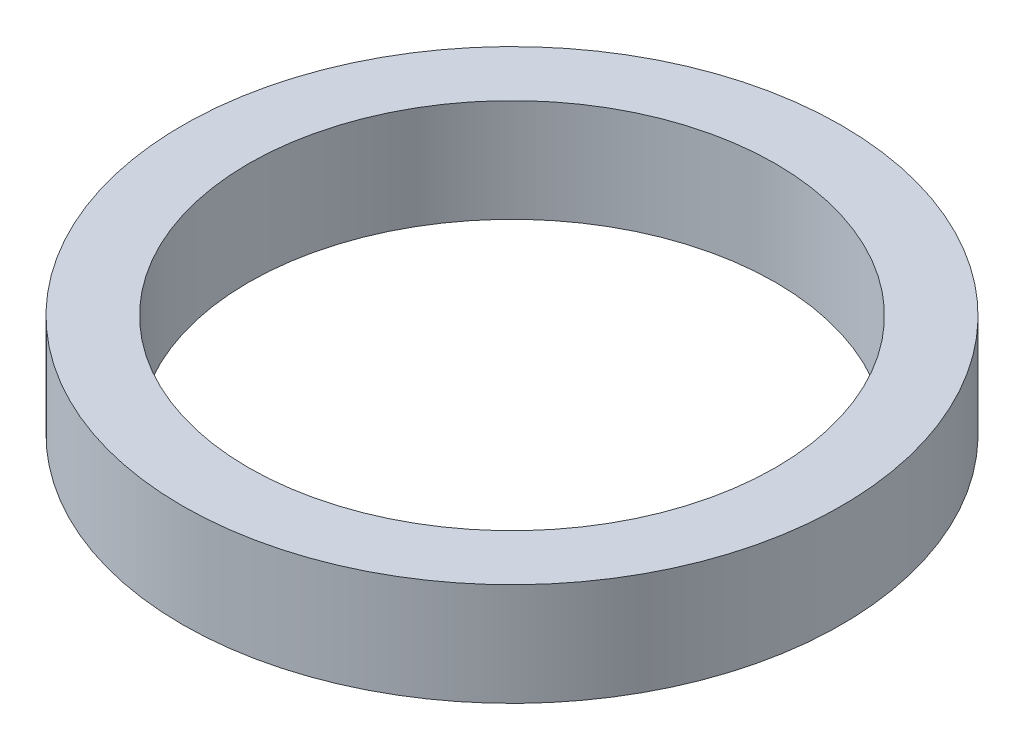
ISO-10303-21;
HEADER;
FILE_DESCRIPTION(('STEP AP214'),'2;1');
FILE_NAME('part.step','',(''),(''),'','','');
FILE_SCHEMA(('AUTOMOTIVE_DESIGN { 1 0 10303 214 1 1 1 1 }'));
ENDSEC;
DATA;
#1=APPLICATION_CONTEXT('core data for automotive mechanical design processes');
#2=APPLICATION_PROTOCOL_DEFINITION('international standard','automotive_design',2000,#1);
#3=PRODUCT_CONTEXT('',#1,'mechanical');
#4=PRODUCT('Part','Part','',(#3));
#5=PRODUCT_RELATED_PRODUCT_CATEGORY('part','',(#4));
#6=PRODUCT_DEFINITION_FORMATION('','',#4);
#7=PRODUCT_DEFINITION_CONTEXT('part definition',#1,'design');
#8=PRODUCT_DEFINITION('design','',#6,#7);
#9=PRODUCT_DEFINITION_SHAPE('','',#8);
#10=(LENGTH_UNIT() NAMED_UNIT(*) SI_UNIT(.MILLI.,.METRE.));
#11=(NAMED_UNIT(*) PLANE_ANGLE_UNIT() SI_UNIT($,.RADIAN.));
#12=(NAMED_UNIT(*) SI_UNIT($,.STERADIAN.) SOLID_ANGLE_UNIT());
#13=UNCERTAINTY_MEASURE_WITH_UNIT(LENGTH_MEASURE(1.E-05),#10,'distance_accuracy_value','');
#14=(GEOMETRIC_REPRESENTATION_CONTEXT(3) GLOBAL_UNCERTAINTY_ASSIGNED_CONTEXT((#13)) GLOBAL_UNIT_ASSIGNED_CONTEXT((#10,
#11,#12)) REPRESENTATION_CONTEXT('',''));
#15=CARTESIAN_POINT('',(0.,0.,0.));
#16=DIRECTION('',(0.,0.,1.));
#17=DIRECTION('',(1.,0.,0.));
#18=AXIS2_PLACEMENT_3D('',#15,#16,#17);
#19=CARTESIAN_POINT('',(0.,4.,0.));
#20=DIRECTION('',(0.,1.,0.));
#21=DIRECTION('',(0.,0.,1.));
#22=AXIS2_PLACEMENT_3D('',#19,#20,#21);
#23=PLANE('',#22);
#24=CARTESIAN_POINT('',(0.,4.,0.));
#25=DIRECTION('',(0.,1.,0.));
#26=DIRECTION('',(0.,0.,1.));
#27=AXIS2_PLACEMENT_3D('',#24,#25,#26);
#28=CIRCLE('',#27,12.825);
#29=CARTESIAN_POINT('',(0.,4.,12.825));
#30=VERTEX_POINT('',#29);
#31=EDGE_CURVE('E10',#30,#30,#28,.T.);
#32=ORIENTED_EDGE('',*,*,#31,.T.);
#33=EDGE_LOOP('',(#32));
#34=FACE_BOUND('',#33,.T.);
#35=CARTESIAN_POINT('',(0.,4.,0.));
#36=DIRECTION('',(0.,1.,0.));
#37=DIRECTION('',(0.,0.,1.));
#38=AXIS2_PLACEMENT_3D('',#35,#36,#37);
#39=CIRCLE('',#38,10.25);
#40=CARTESIAN_POINT('',(0.,4.,10.25));
#41=VERTEX_POINT('',#40);
#42=EDGE_CURVE('E42',#41,#41,#39,.T.);
#43=ORIENTED_EDGE('',*,*,#42,.F.);
#44=EDGE_LOOP('',(#43));
#45=FACE_BOUND('',#44,.T.);
#46=ADVANCED_FACE('F31',(#34,#45),#23,.T.);
#47=CARTESIAN_POINT('',(0.,0.,0.));
#48=DIRECTION('',(0.,1.,0.));
#49=DIRECTION('',(0.,0.,1.));
#50=AXIS2_PLACEMENT_3D('',#47,#48,#49);
#51=PLANE('',#50);
#52=CARTESIAN_POINT('',(0.,0.,0.));
#53=DIRECTION('',(0.,1.,0.));
#54=DIRECTION('',(0.,0.,1.));
#55=AXIS2_PLACEMENT_3D('',#52,#53,#54);
#56=CIRCLE('',#55,12.825);
#57=CARTESIAN_POINT('',(0.,0.,12.825));
#58=VERTEX_POINT('',#57);
#59=EDGE_CURVE('E35',#58,#58,#56,.T.);
#60=ORIENTED_EDGE('',*,*,#59,.F.);
#61=EDGE_LOOP('',(#60));
#62=FACE_BOUND('',#61,.T.);
#63=CARTESIAN_POINT('',(0.,0.,0.));
#64=DIRECTION('',(0.,1.,0.));
#65=DIRECTION('',(0.,0.,1.));
#66=AXIS2_PLACEMENT_3D('',#63,#64,#65);
#67=CIRCLE('',#66,10.25);
#68=CARTESIAN_POINT('',(0.,0.,10.25));
#69=VERTEX_POINT('',#68);
#70=EDGE_CURVE('E44',#69,#69,#67,.T.);
#71=ORIENTED_EDGE('',*,*,#70,.T.);
#72=EDGE_LOOP('',(#71));
#73=FACE_BOUND('',#72,.T.);
#74=ADVANCED_FACE('F54',(#62,#73),#51,.F.);
#75=CARTESIAN_POINT('',(0.,4.,0.));
#76=DIRECTION('',(0.,-1.,0.));
#77=DIRECTION('',(0.,0.,-1.));
#78=AXIS2_PLACEMENT_3D('',#75,#76,#77);
#79=CYLINDRICAL_SURFACE('',#78,12.825);
#80=ORIENTED_EDGE('',*,*,#31,.F.);
#81=EDGE_LOOP('',(#80));
#82=FACE_BOUND('',#81,.T.);
#83=ORIENTED_EDGE('',*,*,#59,.T.);
#84=EDGE_LOOP('',(#83));
#85=FACE_BOUND('',#84,.T.);
#86=ADVANCED_FACE('F33',(#82,#85),#79,.T.);
#87=CARTESIAN_POINT('',(0.,4.,0.));
#88=DIRECTION('',(0.,-1.,0.));
#89=DIRECTION('',(0.,0.,-1.));
#90=AXIS2_PLACEMENT_3D('',#87,#88,#89);
#91=CYLINDRICAL_SURFACE('',#90,10.25);
#92=ORIENTED_EDGE('',*,*,#42,.T.);
#93=EDGE_LOOP('',(#92));
#94=FACE_BOUND('',#93,.T.);
#95=ORIENTED_EDGE('',*,*,#70,.F.);
#96=EDGE_LOOP('',(#95));
#97=FACE_BOUND('',#96,.T.);
#98=ADVANCED_FACE('F50',(#94,#97),#91,.F.);
#99=CLOSED_SHELL('',(#46,#74,#86,#98));
#100=MANIFOLD_SOLID_BREP('B2',#99);
#101=ADVANCED_BREP_SHAPE_REPRESENTATION('',(#18,#100),#14);
#102=SHAPE_DEFINITION_REPRESENTATION(#9,#101);
ENDSEC;
END-ISO-10303-21;
